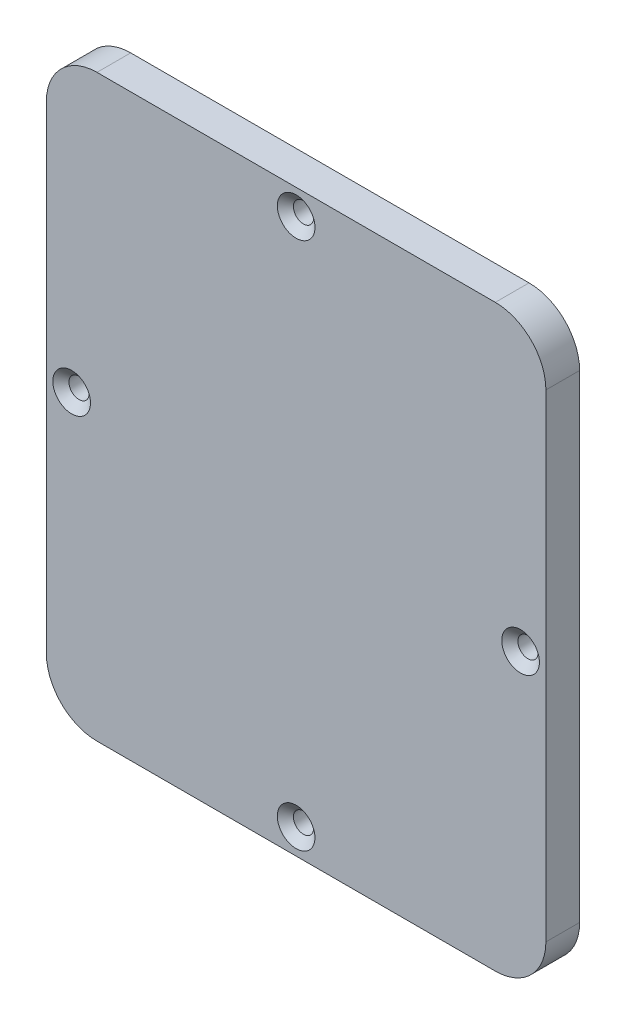
ISO-10303-21;
HEADER;
FILE_DESCRIPTION(('STEP AP214'),'2;1');
FILE_NAME('part.step','',(''),(''),'','','');
FILE_SCHEMA(('AUTOMOTIVE_DESIGN { 1 0 10303 214 1 1 1 1 }'));
ENDSEC;
DATA;
#1=APPLICATION_CONTEXT('core data for automotive mechanical design processes');
#2=APPLICATION_PROTOCOL_DEFINITION('international standard','automotive_design',2000,#1);
#3=PRODUCT_CONTEXT('',#1,'mechanical');
#4=PRODUCT('Part','Part','',(#3));
#5=PRODUCT_RELATED_PRODUCT_CATEGORY('part','',(#4));
#6=PRODUCT_DEFINITION_FORMATION('','',#4);
#7=PRODUCT_DEFINITION_CONTEXT('part definition',#1,'design');
#8=PRODUCT_DEFINITION('design','',#6,#7);
#9=PRODUCT_DEFINITION_SHAPE('','',#8);
#10=(LENGTH_UNIT() NAMED_UNIT(*) SI_UNIT(.MILLI.,.METRE.));
#11=(NAMED_UNIT(*) PLANE_ANGLE_UNIT() SI_UNIT($,.RADIAN.));
#12=(NAMED_UNIT(*) SI_UNIT($,.STERADIAN.) SOLID_ANGLE_UNIT());
#13=UNCERTAINTY_MEASURE_WITH_UNIT(LENGTH_MEASURE(1.E-05),#10,'distance_accuracy_value','');
#14=(GEOMETRIC_REPRESENTATION_CONTEXT(3) GLOBAL_UNCERTAINTY_ASSIGNED_CONTEXT((#13)) GLOBAL_UNIT_ASSIGNED_CONTEXT((#10,
#11,#12)) REPRESENTATION_CONTEXT('',''));
#15=CARTESIAN_POINT('',(0.,0.,0.));
#16=DIRECTION('',(0.,0.,1.));
#17=DIRECTION('',(1.,0.,0.));
#18=AXIS2_PLACEMENT_3D('',#15,#16,#17);
#19=CARTESIAN_POINT('',(3.175,3.175,6.35));
#20=DIRECTION('',(0.,0.,1.));
#21=DIRECTION('',(1.,0.,0.));
#22=AXIS2_PLACEMENT_3D('',#19,#20,#21);
#23=PLANE('',#22);
#24=CARTESIAN_POINT('',(82.937500114,48.175000043,6.35));
#25=DIRECTION('',(0.,0.,1.));
#26=DIRECTION('',(1.,0.,0.));
#27=AXIS2_PLACEMENT_3D('',#24,#25,#26);
#28=CIRCLE('',#27,3.5433);
#29=CARTESIAN_POINT('',(86.480800114,48.175000043,6.35));
#30=VERTEX_POINT('',#29);
#31=EDGE_CURVE('E209',#30,#30,#28,.T.);
#32=ORIENTED_EDGE('',*,*,#31,.F.);
#33=EDGE_LOOP('',(#32));
#34=FACE_BOUND('',#33,.T.);
#35=CARTESIAN_POINT('',(-1.5875,48.175000043,6.35));
#36=DIRECTION('',(0.,0.,1.));
#37=DIRECTION('',(1.,0.,0.));
#38=AXIS2_PLACEMENT_3D('',#35,#36,#37);
#39=CIRCLE('',#38,3.5433);
#40=CARTESIAN_POINT('',(1.9558,48.175000043,6.35));
#41=VERTEX_POINT('',#40);
#42=EDGE_CURVE('E200',#41,#41,#39,.T.);
#43=ORIENTED_EDGE('',*,*,#42,.F.);
#44=EDGE_LOOP('',(#43));
#45=FACE_BOUND('',#44,.T.);
#46=CARTESIAN_POINT('',(40.675000057,-1.58749999999996,6.35));
#47=DIRECTION('',(0.,0.,1.));
#48=DIRECTION('',(1.,0.,0.));
#49=AXIS2_PLACEMENT_3D('',#46,#47,#48);
#50=CIRCLE('',#49,3.5433);
#51=CARTESIAN_POINT('',(44.218300057,-1.58749999999996,6.35));
#52=VERTEX_POINT('',#51);
#53=EDGE_CURVE('E191',#52,#52,#50,.T.);
#54=ORIENTED_EDGE('',*,*,#53,.F.);
#55=EDGE_LOOP('',(#54));
#56=FACE_BOUND('',#55,.T.);
#57=CARTESIAN_POINT('',(40.675000057,97.937500086,6.35));
#58=DIRECTION('',(0.,0.,1.));
#59=DIRECTION('',(1.,0.,0.));
#60=AXIS2_PLACEMENT_3D('',#57,#58,#59);
#61=CIRCLE('',#60,3.5433);
#62=CARTESIAN_POINT('',(44.218300057,97.937500086,6.35));
#63=VERTEX_POINT('',#62);
#64=EDGE_CURVE('E182',#63,#63,#61,.T.);
#65=ORIENTED_EDGE('',*,*,#64,.F.);
#66=EDGE_LOOP('',(#65));
#67=FACE_BOUND('',#66,.T.);
#68=CARTESIAN_POINT('',(3.175,3.175,6.35));
#69=DIRECTION('',(0.,0.,1.));
#70=DIRECTION('',(1.,0.,0.));
#71=AXIS2_PLACEMENT_3D('',#68,#69,#70);
#72=CIRCLE('',#71,9.525);
#73=CARTESIAN_POINT('',(-6.35,3.17500000000007,6.35));
#74=VERTEX_POINT('',#73);
#75=CARTESIAN_POINT('',(3.17500000000007,-6.35,6.35));
#76=VERTEX_POINT('',#75);
#77=EDGE_CURVE('E144',#74,#76,#72,.T.);
#78=ORIENTED_EDGE('',*,*,#77,.T.);
#79=DIRECTION('',(1.,0.,0.));
#80=VECTOR('',#79,1.);
#81=CARTESIAN_POINT('',(3.17500000000007,-6.35,6.35));
#82=LINE('',#81,#80);
#83=CARTESIAN_POINT('',(78.175000114,-6.34999999999999,6.35));
#84=VERTEX_POINT('',#83);
#85=EDGE_CURVE('E93',#76,#84,#82,.T.);
#86=ORIENTED_EDGE('',*,*,#85,.T.);
#87=CARTESIAN_POINT('',(78.175000114,3.175,6.35));
#88=DIRECTION('',(0.,0.,1.));
#89=DIRECTION('',(1.,0.,0.));
#90=AXIS2_PLACEMENT_3D('',#87,#88,#89);
#91=CIRCLE('',#90,9.52499999999999);
#92=CARTESIAN_POINT('',(87.700000114,3.175,6.35));
#93=VERTEX_POINT('',#92);
#94=EDGE_CURVE('E159',#84,#93,#91,.T.);
#95=ORIENTED_EDGE('',*,*,#94,.T.);
#96=DIRECTION('',(0.,1.,0.));
#97=VECTOR('',#96,1.);
#98=CARTESIAN_POINT('',(87.700000114,3.175,6.35));
#99=LINE('',#98,#97);
#100=CARTESIAN_POINT('',(87.700000114,93.175000086,6.35));
#101=VERTEX_POINT('',#100);
#102=EDGE_CURVE('E171',#93,#101,#99,.T.);
#103=ORIENTED_EDGE('',*,*,#102,.T.);
#104=CARTESIAN_POINT('',(78.175000114,93.175000086,6.35));
#105=DIRECTION('',(0.,0.,1.));
#106=DIRECTION('',(1.,0.,0.));
#107=AXIS2_PLACEMENT_3D('',#104,#105,#106);
#108=CIRCLE('',#107,9.52499999999999);
#109=CARTESIAN_POINT('',(78.175000114,102.700000086,6.35));
#110=VERTEX_POINT('',#109);
#111=EDGE_CURVE('E111',#101,#110,#108,.T.);
#112=ORIENTED_EDGE('',*,*,#111,.T.);
#113=DIRECTION('',(-1.,0.,0.));
#114=VECTOR('',#113,1.);
#115=CARTESIAN_POINT('',(78.175000114,102.700000086,6.35));
#116=LINE('',#115,#114);
#117=CARTESIAN_POINT('',(3.175,102.700000086,6.35));
#118=VERTEX_POINT('',#117);
#119=EDGE_CURVE('E106',#110,#118,#116,.T.);
#120=ORIENTED_EDGE('',*,*,#119,.T.);
#121=CARTESIAN_POINT('',(3.175,93.175000086,6.35));
#122=DIRECTION('',(0.,0.,1.));
#123=DIRECTION('',(1.,0.,0.));
#124=AXIS2_PLACEMENT_3D('',#121,#122,#123);
#125=CIRCLE('',#124,9.52499999999999);
#126=CARTESIAN_POINT('',(-6.35,93.175000086,6.35));
#127=VERTEX_POINT('',#126);
#128=EDGE_CURVE('E109',#118,#127,#125,.T.);
#129=ORIENTED_EDGE('',*,*,#128,.T.);
#130=DIRECTION('',(0.,-1.,0.));
#131=VECTOR('',#130,1.);
#132=CARTESIAN_POINT('',(-6.35,93.175000086,6.35));
#133=LINE('',#132,#131);
#134=EDGE_CURVE('E50',#127,#74,#133,.T.);
#135=ORIENTED_EDGE('',*,*,#134,.T.);
#136=EDGE_LOOP('',(#78,#86,#95,#103,#112,#120,#129,#135));
#137=FACE_BOUND('',#136,.T.);
#138=ADVANCED_FACE('F33',(#34,#45,#56,#67,#137),#23,.T.);
#139=CARTESIAN_POINT('',(3.175,3.175,0.));
#140=DIRECTION('',(0.,0.,1.));
#141=DIRECTION('',(1.,0.,0.));
#142=AXIS2_PLACEMENT_3D('',#139,#140,#141);
#143=PLANE('',#142);
#144=CARTESIAN_POINT('',(82.937500114,48.175000043,0.));
#145=DIRECTION('',(0.,0.,1.));
#146=DIRECTION('',(1.,0.,0.));
#147=AXIS2_PLACEMENT_3D('',#144,#145,#146);
#148=CIRCLE('',#147,1.89865);
#149=CARTESIAN_POINT('',(84.836150114,48.175000043,0.));
#150=VERTEX_POINT('',#149);
#151=EDGE_CURVE('E203',#150,#150,#148,.T.);
#152=ORIENTED_EDGE('',*,*,#151,.T.);
#153=EDGE_LOOP('',(#152));
#154=FACE_BOUND('',#153,.T.);
#155=CARTESIAN_POINT('',(-1.5875,48.175000043,0.));
#156=DIRECTION('',(0.,0.,1.));
#157=DIRECTION('',(1.,0.,0.));
#158=AXIS2_PLACEMENT_3D('',#155,#156,#157);
#159=CIRCLE('',#158,1.89865);
#160=CARTESIAN_POINT('',(0.311149999999997,48.175000043,0.));
#161=VERTEX_POINT('',#160);
#162=EDGE_CURVE('E194',#161,#161,#159,.T.);
#163=ORIENTED_EDGE('',*,*,#162,.T.);
#164=EDGE_LOOP('',(#163));
#165=FACE_BOUND('',#164,.T.);
#166=CARTESIAN_POINT('',(40.675000057,-1.58749999999996,0.));
#167=DIRECTION('',(0.,0.,1.));
#168=DIRECTION('',(1.,0.,0.));
#169=AXIS2_PLACEMENT_3D('',#166,#167,#168);
#170=CIRCLE('',#169,1.89865);
#171=CARTESIAN_POINT('',(42.573650057,-1.58749999999996,0.));
#172=VERTEX_POINT('',#171);
#173=EDGE_CURVE('E185',#172,#172,#170,.T.);
#174=ORIENTED_EDGE('',*,*,#173,.T.);
#175=EDGE_LOOP('',(#174));
#176=FACE_BOUND('',#175,.T.);
#177=CARTESIAN_POINT('',(40.675000057,97.937500086,0.));
#178=DIRECTION('',(0.,0.,1.));
#179=DIRECTION('',(1.,0.,0.));
#180=AXIS2_PLACEMENT_3D('',#177,#178,#179);
#181=CIRCLE('',#180,1.89865);
#182=CARTESIAN_POINT('',(42.573650057,97.937500086,0.));
#183=VERTEX_POINT('',#182);
#184=EDGE_CURVE('E133',#183,#183,#181,.T.);
#185=ORIENTED_EDGE('',*,*,#184,.T.);
#186=EDGE_LOOP('',(#185));
#187=FACE_BOUND('',#186,.T.);
#188=CARTESIAN_POINT('',(3.175,3.175,0.));
#189=DIRECTION('',(0.,0.,1.));
#190=DIRECTION('',(1.,0.,0.));
#191=AXIS2_PLACEMENT_3D('',#188,#189,#190);
#192=CIRCLE('',#191,9.525);
#193=CARTESIAN_POINT('',(-6.35,3.17500000000007,0.));
#194=VERTEX_POINT('',#193);
#195=CARTESIAN_POINT('',(3.17500000000007,-6.35,0.));
#196=VERTEX_POINT('',#195);
#197=EDGE_CURVE('E129',#194,#196,#192,.T.);
#198=ORIENTED_EDGE('',*,*,#197,.F.);
#199=DIRECTION('',(0.,-1.,0.));
#200=VECTOR('',#199,1.);
#201=CARTESIAN_POINT('',(-6.35,93.175000086,0.));
#202=LINE('',#201,#200);
#203=CARTESIAN_POINT('',(-6.35,93.175000086,0.));
#204=VERTEX_POINT('',#203);
#205=EDGE_CURVE('E85',#204,#194,#202,.T.);
#206=ORIENTED_EDGE('',*,*,#205,.F.);
#207=CARTESIAN_POINT('',(3.175,93.175000086,0.));
#208=DIRECTION('',(0.,0.,1.));
#209=DIRECTION('',(1.,0.,0.));
#210=AXIS2_PLACEMENT_3D('',#207,#208,#209);
#211=CIRCLE('',#210,9.52499999999999);
#212=CARTESIAN_POINT('',(3.175,102.700000086,0.));
#213=VERTEX_POINT('',#212);
#214=EDGE_CURVE('E79',#213,#204,#211,.T.);
#215=ORIENTED_EDGE('',*,*,#214,.F.);
#216=DIRECTION('',(-1.,0.,0.));
#217=VECTOR('',#216,1.);
#218=CARTESIAN_POINT('',(78.175000114,102.700000086,0.));
#219=LINE('',#218,#217);
#220=CARTESIAN_POINT('',(78.175000114,102.700000086,0.));
#221=VERTEX_POINT('',#220);
#222=EDGE_CURVE('E119',#221,#213,#219,.T.);
#223=ORIENTED_EDGE('',*,*,#222,.F.);
#224=CARTESIAN_POINT('',(78.175000114,93.175000086,0.));
#225=DIRECTION('',(0.,0.,1.));
#226=DIRECTION('',(1.,0.,0.));
#227=AXIS2_PLACEMENT_3D('',#224,#225,#226);
#228=CIRCLE('',#227,9.52499999999999);
#229=CARTESIAN_POINT('',(87.700000114,93.175000086,0.));
#230=VERTEX_POINT('',#229);
#231=EDGE_CURVE('E139',#230,#221,#228,.T.);
#232=ORIENTED_EDGE('',*,*,#231,.F.);
#233=DIRECTION('',(0.,1.,0.));
#234=VECTOR('',#233,1.);
#235=CARTESIAN_POINT('',(87.700000114,3.175,0.));
#236=LINE('',#235,#234);
#237=CARTESIAN_POINT('',(87.700000114,3.175,0.));
#238=VERTEX_POINT('',#237);
#239=EDGE_CURVE('E137',#238,#230,#236,.T.);
#240=ORIENTED_EDGE('',*,*,#239,.F.);
#241=CARTESIAN_POINT('',(78.175000114,3.175,0.));
#242=DIRECTION('',(0.,0.,1.));
#243=DIRECTION('',(1.,0.,0.));
#244=AXIS2_PLACEMENT_3D('',#241,#242,#243);
#245=CIRCLE('',#244,9.52499999999999);
#246=CARTESIAN_POINT('',(78.175000114,-6.34999999999999,0.));
#247=VERTEX_POINT('',#246);
#248=EDGE_CURVE('E135',#247,#238,#245,.T.);
#249=ORIENTED_EDGE('',*,*,#248,.F.);
#250=DIRECTION('',(1.,0.,0.));
#251=VECTOR('',#250,1.);
#252=CARTESIAN_POINT('',(3.17500000000007,-6.35,0.));
#253=LINE('',#252,#251);
#254=EDGE_CURVE('E132',#196,#247,#253,.T.);
#255=ORIENTED_EDGE('',*,*,#254,.F.);
#256=EDGE_LOOP('',(#198,#206,#215,#223,#232,#240,#249,#255));
#257=FACE_BOUND('',#256,.T.);
#258=ADVANCED_FACE('F163',(#154,#165,#176,#187,#257),#143,.F.);
#259=CARTESIAN_POINT('',(3.175,3.175,6.35));
#260=DIRECTION('',(0.,0.,-1.));
#261=DIRECTION('',(-1.,0.,0.));
#262=AXIS2_PLACEMENT_3D('',#259,#260,#261);
#263=CYLINDRICAL_SURFACE('',#262,9.525);
#264=ORIENTED_EDGE('',*,*,#197,.T.);
#265=DIRECTION('',(0.,0.,-1.));
#266=VECTOR('',#265,1.);
#267=CARTESIAN_POINT('',(3.17500000000007,-6.35,6.35));
#268=LINE('',#267,#266);
#269=EDGE_CURVE('E11',#76,#196,#268,.T.);
#270=ORIENTED_EDGE('',*,*,#269,.F.);
#271=ORIENTED_EDGE('',*,*,#77,.F.);
#272=DIRECTION('',(0.,0.,-1.));
#273=VECTOR('',#272,1.);
#274=CARTESIAN_POINT('',(-6.35,3.17500000000007,6.35));
#275=LINE('',#274,#273);
#276=EDGE_CURVE('E125',#74,#194,#275,.T.);
#277=ORIENTED_EDGE('',*,*,#276,.T.);
#278=EDGE_LOOP('',(#264,#270,#271,#277));
#279=FACE_BOUND('',#278,.T.);
#280=ADVANCED_FACE('F35',(#279),#263,.T.);
#281=CARTESIAN_POINT('',(3.17500000000007,-6.35,6.35));
#282=DIRECTION('',(0.,1.,0.));
#283=DIRECTION('',(-1.,0.,0.));
#284=AXIS2_PLACEMENT_3D('',#281,#282,#283);
#285=PLANE('',#284);
#286=ORIENTED_EDGE('',*,*,#254,.T.);
#287=DIRECTION('',(0.,0.,-1.));
#288=VECTOR('',#287,1.);
#289=CARTESIAN_POINT('',(78.175000114,-6.34999999999999,6.35));
#290=LINE('',#289,#288);
#291=EDGE_CURVE('E42',#84,#247,#290,.T.);
#292=ORIENTED_EDGE('',*,*,#291,.F.);
#293=ORIENTED_EDGE('',*,*,#85,.F.);
#294=ORIENTED_EDGE('',*,*,#269,.T.);
#295=EDGE_LOOP('',(#286,#292,#293,#294));
#296=FACE_BOUND('',#295,.T.);
#297=ADVANCED_FACE('F257',(#296),#285,.F.);
#298=CARTESIAN_POINT('',(78.175000114,3.175,6.35));
#299=DIRECTION('',(0.,0.,-1.));
#300=DIRECTION('',(-1.,0.,0.));
#301=AXIS2_PLACEMENT_3D('',#298,#299,#300);
#302=CYLINDRICAL_SURFACE('',#301,9.52499999999999);
#303=ORIENTED_EDGE('',*,*,#248,.T.);
#304=DIRECTION('',(0.,0.,-1.));
#305=VECTOR('',#304,1.);
#306=CARTESIAN_POINT('',(87.700000114,3.175,6.35));
#307=LINE('',#306,#305);
#308=EDGE_CURVE('E151',#93,#238,#307,.T.);
#309=ORIENTED_EDGE('',*,*,#308,.F.);
#310=ORIENTED_EDGE('',*,*,#94,.F.);
#311=ORIENTED_EDGE('',*,*,#291,.T.);
#312=EDGE_LOOP('',(#303,#309,#310,#311));
#313=FACE_BOUND('',#312,.T.);
#314=ADVANCED_FACE('F157',(#313),#302,.T.);
#315=CARTESIAN_POINT('',(87.700000114,3.175,6.35));
#316=DIRECTION('',(-1.,0.,0.));
#317=DIRECTION('',(0.,0.,1.));
#318=AXIS2_PLACEMENT_3D('',#315,#316,#317);
#319=PLANE('',#318);
#320=ORIENTED_EDGE('',*,*,#239,.T.);
#321=DIRECTION('',(0.,0.,-1.));
#322=VECTOR('',#321,1.);
#323=CARTESIAN_POINT('',(87.700000114,93.175000086,6.35));
#324=LINE('',#323,#322);
#325=EDGE_CURVE('E148',#101,#230,#324,.T.);
#326=ORIENTED_EDGE('',*,*,#325,.F.);
#327=ORIENTED_EDGE('',*,*,#102,.F.);
#328=ORIENTED_EDGE('',*,*,#308,.T.);
#329=EDGE_LOOP('',(#320,#326,#327,#328));
#330=FACE_BOUND('',#329,.T.);
#331=ADVANCED_FACE('F167',(#330),#319,.F.);
#332=CARTESIAN_POINT('',(78.175000114,93.175000086,6.35));
#333=DIRECTION('',(0.,0.,-1.));
#334=DIRECTION('',(-1.,0.,0.));
#335=AXIS2_PLACEMENT_3D('',#332,#333,#334);
#336=CYLINDRICAL_SURFACE('',#335,9.52499999999999);
#337=ORIENTED_EDGE('',*,*,#231,.T.);
#338=DIRECTION('',(0.,0.,-1.));
#339=VECTOR('',#338,1.);
#340=CARTESIAN_POINT('',(78.175000114,102.700000086,6.35));
#341=LINE('',#340,#339);
#342=EDGE_CURVE('E120',#110,#221,#341,.T.);
#343=ORIENTED_EDGE('',*,*,#342,.F.);
#344=ORIENTED_EDGE('',*,*,#111,.F.);
#345=ORIENTED_EDGE('',*,*,#325,.T.);
#346=EDGE_LOOP('',(#337,#343,#344,#345));
#347=FACE_BOUND('',#346,.T.);
#348=ADVANCED_FACE('F170',(#347),#336,.T.);
#349=CARTESIAN_POINT('',(78.175000114,102.700000086,6.35));
#350=DIRECTION('',(0.,-1.,0.));
#351=DIRECTION('',(0.,0.,-1.));
#352=AXIS2_PLACEMENT_3D('',#349,#350,#351);
#353=PLANE('',#352);
#354=ORIENTED_EDGE('',*,*,#222,.T.);
#355=DIRECTION('',(0.,0.,-1.));
#356=VECTOR('',#355,1.);
#357=CARTESIAN_POINT('',(3.175,102.700000086,6.35));
#358=LINE('',#357,#356);
#359=EDGE_CURVE('E116',#118,#213,#358,.T.);
#360=ORIENTED_EDGE('',*,*,#359,.F.);
#361=ORIENTED_EDGE('',*,*,#119,.F.);
#362=ORIENTED_EDGE('',*,*,#342,.T.);
#363=EDGE_LOOP('',(#354,#360,#361,#362));
#364=FACE_BOUND('',#363,.T.);
#365=ADVANCED_FACE('F117',(#364),#353,.F.);
#366=CARTESIAN_POINT('',(3.175,93.175000086,6.35));
#367=DIRECTION('',(0.,0.,-1.));
#368=DIRECTION('',(-1.,0.,0.));
#369=AXIS2_PLACEMENT_3D('',#366,#367,#368);
#370=CYLINDRICAL_SURFACE('',#369,9.52499999999999);
#371=ORIENTED_EDGE('',*,*,#214,.T.);
#372=DIRECTION('',(0.,0.,-1.));
#373=VECTOR('',#372,1.);
#374=CARTESIAN_POINT('',(-6.35,93.175000086,6.35));
#375=LINE('',#374,#373);
#376=EDGE_CURVE('E121',#127,#204,#375,.T.);
#377=ORIENTED_EDGE('',*,*,#376,.F.);
#378=ORIENTED_EDGE('',*,*,#128,.F.);
#379=ORIENTED_EDGE('',*,*,#359,.T.);
#380=EDGE_LOOP('',(#371,#377,#378,#379));
#381=FACE_BOUND('',#380,.T.);
#382=ADVANCED_FACE('F123',(#381),#370,.T.);
#383=CARTESIAN_POINT('',(-6.35,93.175000086,6.35));
#384=DIRECTION('',(1.,0.,0.));
#385=DIRECTION('',(0.,1.,0.));
#386=AXIS2_PLACEMENT_3D('',#383,#384,#385);
#387=PLANE('',#386);
#388=ORIENTED_EDGE('',*,*,#205,.T.);
#389=ORIENTED_EDGE('',*,*,#276,.F.);
#390=ORIENTED_EDGE('',*,*,#134,.F.);
#391=ORIENTED_EDGE('',*,*,#376,.T.);
#392=EDGE_LOOP('',(#388,#389,#390,#391));
#393=FACE_BOUND('',#392,.T.);
#394=ADVANCED_FACE('F237',(#393),#387,.F.);
#395=CARTESIAN_POINT('',(40.675000057,97.937500086,6.35));
#396=DIRECTION('',(0.,0.,1.));
#397=DIRECTION('',(1.,0.,0.));
#398=AXIS2_PLACEMENT_3D('',#395,#396,#397);
#399=CYLINDRICAL_SURFACE('',#398,1.89864999999999);
#400=ORIENTED_EDGE('',*,*,#184,.F.);
#401=EDGE_LOOP('',(#400));
#402=FACE_BOUND('',#401,.T.);
#403=CARTESIAN_POINT('',(40.675000057,97.937500086,4.96997479158429));
#404=DIRECTION('',(0.,0.,1.));
#405=DIRECTION('',(1.,0.,0.));
#406=AXIS2_PLACEMENT_3D('',#403,#404,#405);
#407=CIRCLE('',#406,1.89864999999999);
#408=CARTESIAN_POINT('',(42.573650057,97.937500086,4.96997479158429));
#409=VERTEX_POINT('',#408);
#410=EDGE_CURVE('E179',#409,#409,#407,.T.);
#411=ORIENTED_EDGE('',*,*,#410,.T.);
#412=EDGE_LOOP('',(#411));
#413=FACE_BOUND('',#412,.T.);
#414=ADVANCED_FACE('F227',(#402,#413),#399,.F.);
#415=CARTESIAN_POINT('',(40.675000057,97.937500086,6.35));
#416=DIRECTION('',(0.,0.,1.));
#417=DIRECTION('',(1.,0.,0.));
#418=AXIS2_PLACEMENT_3D('',#415,#416,#417);
#419=CONICAL_SURFACE('',#418,3.5433,0.872664625997169);
#420=ORIENTED_EDGE('',*,*,#410,.F.);
#421=EDGE_LOOP('',(#420));
#422=FACE_BOUND('',#421,.T.);
#423=ORIENTED_EDGE('',*,*,#64,.T.);
#424=EDGE_LOOP('',(#423));
#425=FACE_BOUND('',#424,.T.);
#426=ADVANCED_FACE('F224',(#422,#425),#419,.F.);
#427=CARTESIAN_POINT('',(40.675000057,-1.58749999999996,6.35));
#428=DIRECTION('',(0.,0.,1.));
#429=DIRECTION('',(1.,0.,0.));
#430=AXIS2_PLACEMENT_3D('',#427,#428,#429);
#431=CYLINDRICAL_SURFACE('',#430,1.89864999999999);
#432=ORIENTED_EDGE('',*,*,#173,.F.);
#433=EDGE_LOOP('',(#432));
#434=FACE_BOUND('',#433,.T.);
#435=CARTESIAN_POINT('',(40.675000057,-1.58749999999996,4.96997479158429));
#436=DIRECTION('',(0.,0.,1.));
#437=DIRECTION('',(1.,0.,0.));
#438=AXIS2_PLACEMENT_3D('',#435,#436,#437);
#439=CIRCLE('',#438,1.89864999999999);
#440=CARTESIAN_POINT('',(42.573650057,-1.58749999999996,4.96997479158429));
#441=VERTEX_POINT('',#440);
#442=EDGE_CURVE('E188',#441,#441,#439,.T.);
#443=ORIENTED_EDGE('',*,*,#442,.T.);
#444=EDGE_LOOP('',(#443));
#445=FACE_BOUND('',#444,.T.);
#446=ADVANCED_FACE('F226',(#434,#445),#431,.F.);
#447=CARTESIAN_POINT('',(40.675000057,-1.58749999999996,6.35));
#448=DIRECTION('',(0.,0.,1.));
#449=DIRECTION('',(1.,0.,0.));
#450=AXIS2_PLACEMENT_3D('',#447,#448,#449);
#451=CONICAL_SURFACE('',#450,3.5433,0.872664625997169);
#452=ORIENTED_EDGE('',*,*,#442,.F.);
#453=EDGE_LOOP('',(#452));
#454=FACE_BOUND('',#453,.T.);
#455=ORIENTED_EDGE('',*,*,#53,.T.);
#456=EDGE_LOOP('',(#455));
#457=FACE_BOUND('',#456,.T.);
#458=ADVANCED_FACE('F234',(#454,#457),#451,.F.);
#459=CARTESIAN_POINT('',(-1.5875,48.175000043,6.35));
#460=DIRECTION('',(0.,0.,1.));
#461=DIRECTION('',(1.,0.,0.));
#462=AXIS2_PLACEMENT_3D('',#459,#460,#461);
#463=CYLINDRICAL_SURFACE('',#462,1.89864999999999);
#464=ORIENTED_EDGE('',*,*,#162,.F.);
#465=EDGE_LOOP('',(#464));
#466=FACE_BOUND('',#465,.T.);
#467=CARTESIAN_POINT('',(-1.5875,48.175000043,4.96997479158429));
#468=DIRECTION('',(0.,0.,1.));
#469=DIRECTION('',(1.,0.,0.));
#470=AXIS2_PLACEMENT_3D('',#467,#468,#469);
#471=CIRCLE('',#470,1.89864999999999);
#472=CARTESIAN_POINT('',(0.311149999999985,48.175000043,4.96997479158429));
#473=VERTEX_POINT('',#472);
#474=EDGE_CURVE('E197',#473,#473,#471,.T.);
#475=ORIENTED_EDGE('',*,*,#474,.T.);
#476=EDGE_LOOP('',(#475));
#477=FACE_BOUND('',#476,.T.);
#478=ADVANCED_FACE('F344',(#466,#477),#463,.F.);
#479=CARTESIAN_POINT('',(-1.5875,48.175000043,6.35));
#480=DIRECTION('',(0.,0.,1.));
#481=DIRECTION('',(1.,0.,0.));
#482=AXIS2_PLACEMENT_3D('',#479,#480,#481);
#483=CONICAL_SURFACE('',#482,3.5433,0.872664625997169);
#484=ORIENTED_EDGE('',*,*,#474,.F.);
#485=EDGE_LOOP('',(#484));
#486=FACE_BOUND('',#485,.T.);
#487=ORIENTED_EDGE('',*,*,#42,.T.);
#488=EDGE_LOOP('',(#487));
#489=FACE_BOUND('',#488,.T.);
#490=ADVANCED_FACE('F353',(#486,#489),#483,.F.);
#491=CARTESIAN_POINT('',(82.937500114,48.175000043,6.35));
#492=DIRECTION('',(0.,0.,1.));
#493=DIRECTION('',(1.,0.,0.));
#494=AXIS2_PLACEMENT_3D('',#491,#492,#493);
#495=CYLINDRICAL_SURFACE('',#494,1.89864999999999);
#496=ORIENTED_EDGE('',*,*,#151,.F.);
#497=EDGE_LOOP('',(#496));
#498=FACE_BOUND('',#497,.T.);
#499=CARTESIAN_POINT('',(82.937500114,48.175000043,4.96997479158429));
#500=DIRECTION('',(0.,0.,1.));
#501=DIRECTION('',(1.,0.,0.));
#502=AXIS2_PLACEMENT_3D('',#499,#500,#501);
#503=CIRCLE('',#502,1.89864999999999);
#504=CARTESIAN_POINT('',(84.836150114,48.175000043,4.96997479158429));
#505=VERTEX_POINT('',#504);
#506=EDGE_CURVE('E206',#505,#505,#503,.T.);
#507=ORIENTED_EDGE('',*,*,#506,.T.);
#508=EDGE_LOOP('',(#507));
#509=FACE_BOUND('',#508,.T.);
#510=ADVANCED_FACE('F363',(#498,#509),#495,.F.);
#511=CARTESIAN_POINT('',(82.937500114,48.175000043,6.35));
#512=DIRECTION('',(0.,0.,1.));
#513=DIRECTION('',(1.,0.,0.));
#514=AXIS2_PLACEMENT_3D('',#511,#512,#513);
#515=CONICAL_SURFACE('',#514,3.5433,0.872664625997169);
#516=ORIENTED_EDGE('',*,*,#506,.F.);
#517=EDGE_LOOP('',(#516));
#518=FACE_BOUND('',#517,.T.);
#519=ORIENTED_EDGE('',*,*,#31,.T.);
#520=EDGE_LOOP('',(#519));
#521=FACE_BOUND('',#520,.T.);
#522=ADVANCED_FACE('F213',(#518,#521),#515,.F.);
#523=CLOSED_SHELL('',(#138,#258,#280,#297,#314,#331,#348,#365,#382,#394,#414,#426,#446,#458,
#478,#490,#510,#522));
#524=MANIFOLD_SOLID_BREP('B2',#523);
#525=ADVANCED_BREP_SHAPE_REPRESENTATION('',(#18,#524),#14);
#526=SHAPE_DEFINITION_REPRESENTATION(#9,#525);
ENDSEC;
END-ISO-10303-21;
